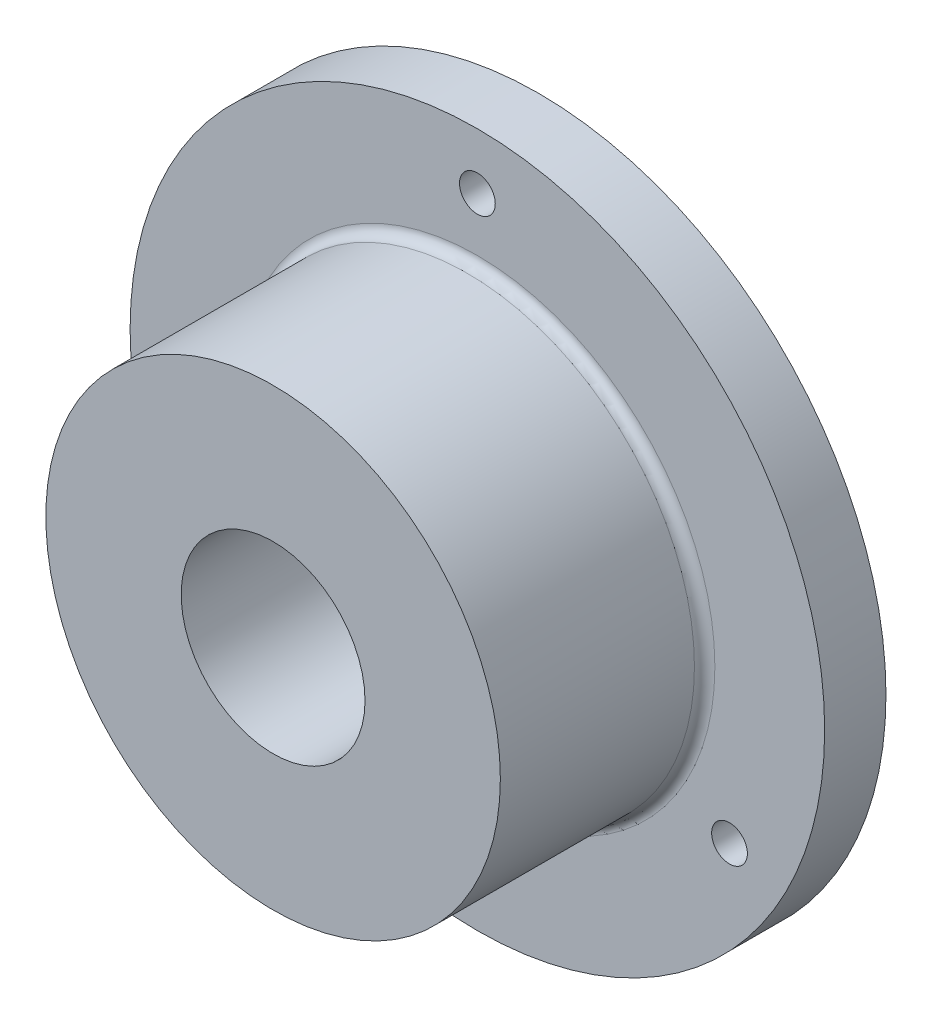
ISO-10303-21;
HEADER;
FILE_DESCRIPTION(('STEP AP214'),'2;1');
FILE_NAME('part.step','',(''),(''),'','','');
FILE_SCHEMA(('AUTOMOTIVE_DESIGN { 1 0 10303 214 1 1 1 1 }'));
ENDSEC;
DATA;
#1=APPLICATION_CONTEXT('core data for automotive mechanical design processes');
#2=APPLICATION_PROTOCOL_DEFINITION('international standard','automotive_design',2000,#1);
#3=PRODUCT_CONTEXT('',#1,'mechanical');
#4=PRODUCT('Part','Part','',(#3));
#5=PRODUCT_RELATED_PRODUCT_CATEGORY('part','',(#4));
#6=PRODUCT_DEFINITION_FORMATION('','',#4);
#7=PRODUCT_DEFINITION_CONTEXT('part definition',#1,'design');
#8=PRODUCT_DEFINITION('design','',#6,#7);
#9=PRODUCT_DEFINITION_SHAPE('','',#8);
#10=(LENGTH_UNIT() NAMED_UNIT(*) SI_UNIT(.MILLI.,.METRE.));
#11=(NAMED_UNIT(*) PLANE_ANGLE_UNIT() SI_UNIT($,.RADIAN.));
#12=(NAMED_UNIT(*) SI_UNIT($,.STERADIAN.) SOLID_ANGLE_UNIT());
#13=UNCERTAINTY_MEASURE_WITH_UNIT(LENGTH_MEASURE(1.E-05),#10,'distance_accuracy_value','');
#14=(GEOMETRIC_REPRESENTATION_CONTEXT(3) GLOBAL_UNCERTAINTY_ASSIGNED_CONTEXT((#13)) GLOBAL_UNIT_ASSIGNED_CONTEXT((#10,
#11,#12)) REPRESENTATION_CONTEXT('',''));
#15=CARTESIAN_POINT('',(0.,0.,0.));
#16=DIRECTION('',(0.,0.,1.));
#17=DIRECTION('',(1.,0.,0.));
#18=AXIS2_PLACEMENT_3D('',#15,#16,#17);
#19=CARTESIAN_POINT('',(0.,0.,6.));
#20=DIRECTION('',(0.,0.,-1.));
#21=DIRECTION('',(-1.,0.,0.));
#22=AXIS2_PLACEMENT_3D('',#19,#20,#21);
#23=CYLINDRICAL_SURFACE('',#22,34.);
#24=CARTESIAN_POINT('',(0.,0.,6.));
#25=DIRECTION('',(0.,0.,1.));
#26=DIRECTION('',(1.,0.,0.));
#27=AXIS2_PLACEMENT_3D('',#24,#25,#26);
#28=CIRCLE('',#27,34.);
#29=CARTESIAN_POINT('',(34.,0.,6.));
#30=VERTEX_POINT('',#29);
#31=EDGE_CURVE('E45',#30,#30,#28,.T.);
#32=ORIENTED_EDGE('',*,*,#31,.F.);
#33=EDGE_LOOP('',(#32));
#34=FACE_BOUND('',#33,.T.);
#35=CARTESIAN_POINT('',(0.,0.,0.));
#36=DIRECTION('',(0.,0.,1.));
#37=DIRECTION('',(1.,0.,0.));
#38=AXIS2_PLACEMENT_3D('',#35,#36,#37);
#39=CIRCLE('',#38,34.);
#40=CARTESIAN_POINT('',(34.,0.,0.));
#41=VERTEX_POINT('',#40);
#42=EDGE_CURVE('E48',#41,#41,#39,.T.);
#43=ORIENTED_EDGE('',*,*,#42,.T.);
#44=EDGE_LOOP('',(#43));
#45=FACE_BOUND('',#44,.T.);
#46=ADVANCED_FACE('F33',(#34,#45),#23,.T.);
#47=CARTESIAN_POINT('',(0.,0.,6.));
#48=DIRECTION('',(0.,0.,1.));
#49=DIRECTION('',(1.,0.,0.));
#50=AXIS2_PLACEMENT_3D('',#47,#48,#49);
#51=PLANE('',#50);
#52=CARTESIAN_POINT('',(0.,0.,6.));
#53=DIRECTION('',(0.,0.,1.));
#54=DIRECTION('',(1.,0.,0.));
#55=AXIS2_PLACEMENT_3D('',#52,#53,#54);
#56=CIRCLE('',#55,23.25);
#57=CARTESIAN_POINT('',(23.25,0.,6.));
#58=VERTEX_POINT('',#57);
#59=EDGE_CURVE('E10',#58,#58,#56,.F.);
#60=ORIENTED_EDGE('',*,*,#59,.T.);
#61=EDGE_LOOP('',(#60));
#62=FACE_BOUND('',#61,.T.);
#63=CARTESIAN_POINT('',(0.,28.5,6.));
#64=DIRECTION('',(0.,0.,1.));
#65=DIRECTION('',(1.,0.,0.));
#66=AXIS2_PLACEMENT_3D('',#63,#64,#65);
#67=CIRCLE('',#66,1.75);
#68=CARTESIAN_POINT('',(1.75,28.5,6.));
#69=VERTEX_POINT('',#68);
#70=EDGE_CURVE('E69',#69,#69,#67,.T.);
#71=ORIENTED_EDGE('',*,*,#70,.F.);
#72=EDGE_LOOP('',(#71));
#73=FACE_BOUND('',#72,.T.);
#74=CARTESIAN_POINT('',(24.6817240078583,-14.249999999999,6.));
#75=DIRECTION('',(0.,0.,1.));
#76=DIRECTION('',(1.,0.,0.));
#77=AXIS2_PLACEMENT_3D('',#74,#75,#76);
#78=CIRCLE('',#77,1.75);
#79=CARTESIAN_POINT('',(26.4317240078583,-14.249999999999,6.));
#80=VERTEX_POINT('',#79);
#81=EDGE_CURVE('E63',#80,#80,#78,.T.);
#82=ORIENTED_EDGE('',*,*,#81,.F.);
#83=EDGE_LOOP('',(#82));
#84=FACE_BOUND('',#83,.T.);
#85=CARTESIAN_POINT('',(-24.6817240078548,-14.250000000001,6.));
#86=DIRECTION('',(0.,0.,1.));
#87=DIRECTION('',(1.,0.,0.));
#88=AXIS2_PLACEMENT_3D('',#85,#86,#87);
#89=CIRCLE('',#88,1.75);
#90=CARTESIAN_POINT('',(-22.9317240078548,-14.250000000001,6.));
#91=VERTEX_POINT('',#90);
#92=EDGE_CURVE('E57',#91,#91,#89,.T.);
#93=ORIENTED_EDGE('',*,*,#92,.F.);
#94=EDGE_LOOP('',(#93));
#95=FACE_BOUND('',#94,.T.);
#96=ORIENTED_EDGE('',*,*,#31,.T.);
#97=EDGE_LOOP('',(#96));
#98=FACE_BOUND('',#97,.T.);
#99=ADVANCED_FACE('F99',(#62,#73,#84,#95,#98),#51,.T.);
#100=CARTESIAN_POINT('',(0.,0.,0.));
#101=DIRECTION('',(0.,0.,1.));
#102=DIRECTION('',(1.,0.,0.));
#103=AXIS2_PLACEMENT_3D('',#100,#101,#102);
#104=PLANE('',#103);
#105=CARTESIAN_POINT('',(0.,0.,0.));
#106=DIRECTION('',(0.,0.,1.));
#107=DIRECTION('',(1.,0.,0.));
#108=AXIS2_PLACEMENT_3D('',#105,#106,#107);
#109=CIRCLE('',#108,9.);
#110=CARTESIAN_POINT('',(9.,0.,0.));
#111=VERTEX_POINT('',#110);
#112=EDGE_CURVE('E74',#111,#111,#109,.T.);
#113=ORIENTED_EDGE('',*,*,#112,.T.);
#114=EDGE_LOOP('',(#113));
#115=FACE_BOUND('',#114,.T.);
#116=CARTESIAN_POINT('',(0.,28.5,0.));
#117=DIRECTION('',(0.,0.,1.));
#118=DIRECTION('',(1.,0.,0.));
#119=AXIS2_PLACEMENT_3D('',#116,#117,#118);
#120=CIRCLE('',#119,1.75);
#121=CARTESIAN_POINT('',(1.75,28.5,0.));
#122=VERTEX_POINT('',#121);
#123=EDGE_CURVE('E56',#122,#122,#120,.T.);
#124=ORIENTED_EDGE('',*,*,#123,.T.);
#125=EDGE_LOOP('',(#124));
#126=FACE_BOUND('',#125,.T.);
#127=CARTESIAN_POINT('',(24.6817240078583,-14.249999999999,0.));
#128=DIRECTION('',(0.,0.,1.));
#129=DIRECTION('',(1.,0.,0.));
#130=AXIS2_PLACEMENT_3D('',#127,#128,#129);
#131=CIRCLE('',#130,1.75);
#132=CARTESIAN_POINT('',(26.4317240078583,-14.249999999999,0.));
#133=VERTEX_POINT('',#132);
#134=EDGE_CURVE('E66',#133,#133,#131,.T.);
#135=ORIENTED_EDGE('',*,*,#134,.T.);
#136=EDGE_LOOP('',(#135));
#137=FACE_BOUND('',#136,.T.);
#138=CARTESIAN_POINT('',(-24.6817240078548,-14.250000000001,0.));
#139=DIRECTION('',(0.,0.,1.));
#140=DIRECTION('',(1.,0.,0.));
#141=AXIS2_PLACEMENT_3D('',#138,#139,#140);
#142=CIRCLE('',#141,1.75);
#143=CARTESIAN_POINT('',(-22.9317240078548,-14.250000000001,0.));
#144=VERTEX_POINT('',#143);
#145=EDGE_CURVE('E60',#144,#144,#142,.T.);
#146=ORIENTED_EDGE('',*,*,#145,.T.);
#147=EDGE_LOOP('',(#146));
#148=FACE_BOUND('',#147,.T.);
#149=ORIENTED_EDGE('',*,*,#42,.F.);
#150=EDGE_LOOP('',(#149));
#151=FACE_BOUND('',#150,.T.);
#152=ADVANCED_FACE('F93',(#115,#126,#137,#148,#151),#104,.F.);
#153=CARTESIAN_POINT('',(0.,0.,26.));
#154=DIRECTION('',(0.,0.,-1.));
#155=DIRECTION('',(-1.,0.,0.));
#156=AXIS2_PLACEMENT_3D('',#153,#154,#155);
#157=CYLINDRICAL_SURFACE('',#156,22.25);
#158=CARTESIAN_POINT('',(0.,0.,7.));
#159=DIRECTION('',(0.,0.,1.));
#160=DIRECTION('',(1.,0.,0.));
#161=AXIS2_PLACEMENT_3D('',#158,#159,#160);
#162=CIRCLE('',#161,22.25);
#163=CARTESIAN_POINT('',(22.25,0.,7.));
#164=VERTEX_POINT('',#163);
#165=EDGE_CURVE('E41',#164,#164,#162,.T.);
#166=ORIENTED_EDGE('',*,*,#165,.T.);
#167=EDGE_LOOP('',(#166));
#168=FACE_BOUND('',#167,.T.);
#169=CARTESIAN_POINT('',(0.,0.,26.));
#170=DIRECTION('',(0.,0.,1.));
#171=DIRECTION('',(1.,0.,0.));
#172=AXIS2_PLACEMENT_3D('',#169,#170,#171);
#173=CIRCLE('',#172,22.25);
#174=CARTESIAN_POINT('',(22.25,0.,26.));
#175=VERTEX_POINT('',#174);
#176=EDGE_CURVE('E51',#175,#175,#173,.T.);
#177=ORIENTED_EDGE('',*,*,#176,.F.);
#178=EDGE_LOOP('',(#177));
#179=FACE_BOUND('',#178,.T.);
#180=ADVANCED_FACE('F88',(#168,#179),#157,.T.);
#181=CARTESIAN_POINT('',(0.,0.,26.));
#182=DIRECTION('',(0.,0.,1.));
#183=DIRECTION('',(1.,0.,0.));
#184=AXIS2_PLACEMENT_3D('',#181,#182,#183);
#185=PLANE('',#184);
#186=CARTESIAN_POINT('',(0.,0.,26.));
#187=DIRECTION('',(0.,0.,1.));
#188=DIRECTION('',(1.,0.,0.));
#189=AXIS2_PLACEMENT_3D('',#186,#187,#188);
#190=CIRCLE('',#189,9.);
#191=CARTESIAN_POINT('',(9.,0.,26.));
#192=VERTEX_POINT('',#191);
#193=EDGE_CURVE('E37',#192,#192,#190,.T.);
#194=ORIENTED_EDGE('',*,*,#193,.F.);
#195=EDGE_LOOP('',(#194));
#196=FACE_BOUND('',#195,.T.);
#197=ORIENTED_EDGE('',*,*,#176,.T.);
#198=EDGE_LOOP('',(#197));
#199=FACE_BOUND('',#198,.T.);
#200=ADVANCED_FACE('F84',(#196,#199),#185,.T.);
#201=CARTESIAN_POINT('',(-24.6817240078548,-14.250000000001,0.));
#202=DIRECTION('',(0.,0.,1.));
#203=DIRECTION('',(1.,0.,0.));
#204=AXIS2_PLACEMENT_3D('',#201,#202,#203);
#205=CYLINDRICAL_SURFACE('',#204,1.75);
#206=ORIENTED_EDGE('',*,*,#145,.F.);
#207=EDGE_LOOP('',(#206));
#208=FACE_BOUND('',#207,.T.);
#209=ORIENTED_EDGE('',*,*,#92,.T.);
#210=EDGE_LOOP('',(#209));
#211=FACE_BOUND('',#210,.T.);
#212=ADVANCED_FACE('F87',(#208,#211),#205,.F.);
#213=CARTESIAN_POINT('',(24.6817240078583,-14.249999999999,0.));
#214=DIRECTION('',(0.,0.,1.));
#215=DIRECTION('',(1.,0.,0.));
#216=AXIS2_PLACEMENT_3D('',#213,#214,#215);
#217=CYLINDRICAL_SURFACE('',#216,1.75);
#218=ORIENTED_EDGE('',*,*,#134,.F.);
#219=EDGE_LOOP('',(#218));
#220=FACE_BOUND('',#219,.T.);
#221=ORIENTED_EDGE('',*,*,#81,.T.);
#222=EDGE_LOOP('',(#221));
#223=FACE_BOUND('',#222,.T.);
#224=ADVANCED_FACE('F122',(#220,#223),#217,.F.);
#225=CARTESIAN_POINT('',(0.,28.5,0.));
#226=DIRECTION('',(0.,0.,1.));
#227=DIRECTION('',(1.,0.,0.));
#228=AXIS2_PLACEMENT_3D('',#225,#226,#227);
#229=CYLINDRICAL_SURFACE('',#228,1.75);
#230=ORIENTED_EDGE('',*,*,#123,.F.);
#231=EDGE_LOOP('',(#230));
#232=FACE_BOUND('',#231,.T.);
#233=ORIENTED_EDGE('',*,*,#70,.T.);
#234=EDGE_LOOP('',(#233));
#235=FACE_BOUND('',#234,.T.);
#236=ADVANCED_FACE('F128',(#232,#235),#229,.F.);
#237=CARTESIAN_POINT('',(0.,0.,7.));
#238=DIRECTION('',(0.,0.,1.));
#239=DIRECTION('',(1.,0.,0.));
#240=AXIS2_PLACEMENT_3D('',#237,#238,#239);
#241=TOROIDAL_SURFACE('',#240,23.25,1.);
#242=ORIENTED_EDGE('',*,*,#59,.F.);
#243=EDGE_LOOP('',(#242));
#244=FACE_BOUND('',#243,.T.);
#245=ORIENTED_EDGE('',*,*,#165,.F.);
#246=EDGE_LOOP('',(#245));
#247=FACE_BOUND('',#246,.T.);
#248=ADVANCED_FACE('F35',(#244,#247),#241,.F.);
#249=CARTESIAN_POINT('',(0.,0.,0.));
#250=DIRECTION('',(0.,0.,1.));
#251=DIRECTION('',(1.,0.,0.));
#252=AXIS2_PLACEMENT_3D('',#249,#250,#251);
#253=CYLINDRICAL_SURFACE('',#252,9.);
#254=ORIENTED_EDGE('',*,*,#193,.T.);
#255=EDGE_LOOP('',(#254));
#256=FACE_BOUND('',#255,.T.);
#257=ORIENTED_EDGE('',*,*,#112,.F.);
#258=EDGE_LOOP('',(#257));
#259=FACE_BOUND('',#258,.T.);
#260=ADVANCED_FACE('F81',(#256,#259),#253,.F.);
#261=CLOSED_SHELL('',(#46,#99,#152,#180,#200,#212,#224,#236,#248,#260));
#262=MANIFOLD_SOLID_BREP('B2',#261);
#263=ADVANCED_BREP_SHAPE_REPRESENTATION('',(#18,#262),#14);
#264=SHAPE_DEFINITION_REPRESENTATION(#9,#263);
ENDSEC;
END-ISO-10303-21;
